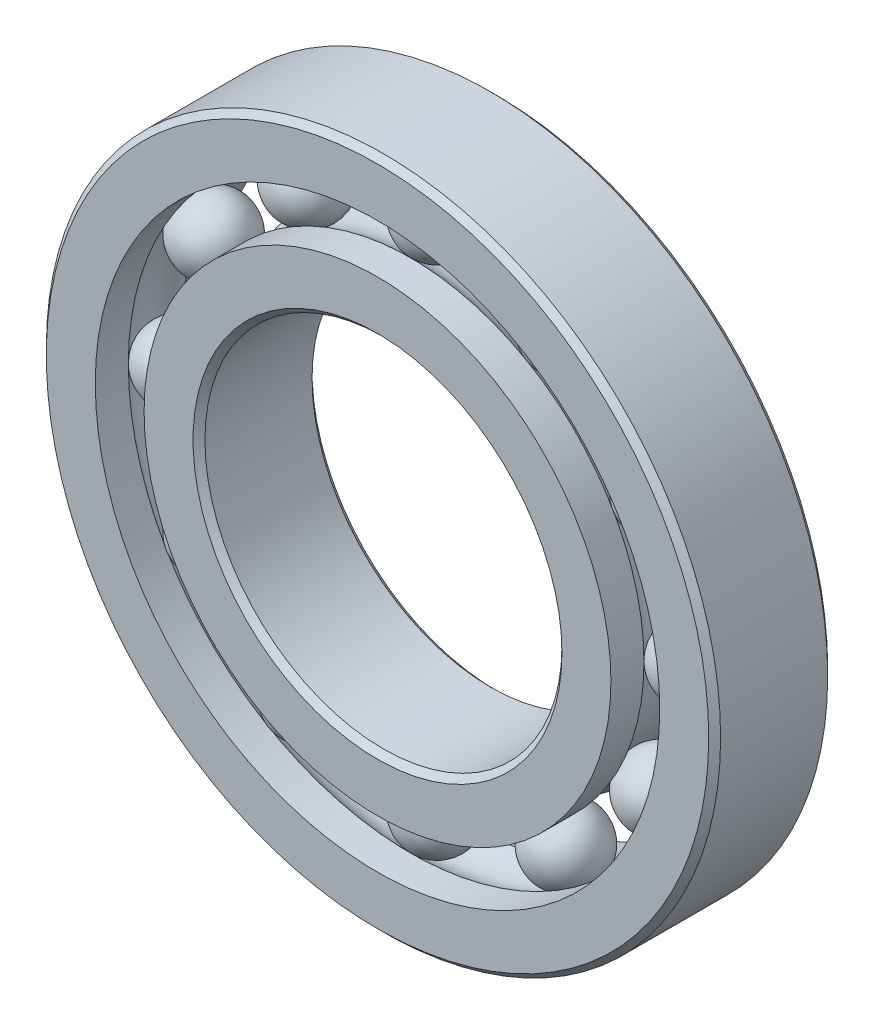
ISO-10303-21;
HEADER;
FILE_DESCRIPTION(('STEP AP214'),'2;1');
FILE_NAME('part.step','',(''),(''),'','','');
FILE_SCHEMA(('AUTOMOTIVE_DESIGN { 1 0 10303 214 1 1 1 1 }'));
ENDSEC;
DATA;
#1=APPLICATION_CONTEXT('core data for automotive mechanical design processes');
#2=APPLICATION_PROTOCOL_DEFINITION('international standard','automotive_design',2000,#1);
#3=PRODUCT_CONTEXT('',#1,'mechanical');
#4=PRODUCT('Part','Part','',(#3));
#5=PRODUCT_RELATED_PRODUCT_CATEGORY('part','',(#4));
#6=PRODUCT_DEFINITION_FORMATION('','',#4);
#7=PRODUCT_DEFINITION_CONTEXT('part definition',#1,'design');
#8=PRODUCT_DEFINITION('design','',#6,#7);
#9=PRODUCT_DEFINITION_SHAPE('','',#8);
#10=(LENGTH_UNIT() NAMED_UNIT(*) SI_UNIT(.MILLI.,.METRE.));
#11=(NAMED_UNIT(*) PLANE_ANGLE_UNIT() SI_UNIT($,.RADIAN.));
#12=(NAMED_UNIT(*) SI_UNIT($,.STERADIAN.) SOLID_ANGLE_UNIT());
#13=UNCERTAINTY_MEASURE_WITH_UNIT(LENGTH_MEASURE(1.E-05),#10,'distance_accuracy_value','');
#14=(GEOMETRIC_REPRESENTATION_CONTEXT(3) GLOBAL_UNCERTAINTY_ASSIGNED_CONTEXT((#13)) GLOBAL_UNIT_ASSIGNED_CONTEXT((#10,
#11,#12)) REPRESENTATION_CONTEXT('',''));
#15=CARTESIAN_POINT('',(0.,0.,0.));
#16=DIRECTION('',(0.,0.,1.));
#17=DIRECTION('',(1.,0.,0.));
#18=AXIS2_PLACEMENT_3D('',#15,#16,#17);
#19=CARTESIAN_POINT('',(-10.3187499999998,17.8725992706015,0.));
#20=DIRECTION('',(0.,0.,1.));
#21=DIRECTION('',(-0.499999999999989,0.866025403784445,0.));
#22=AXIS2_PLACEMENT_3D('',#19,#20,#21);
#23=SPHERICAL_SURFACE('',#22,2.88058892775022);
#24=CARTESIAN_POINT('',(-10.3187499999998,17.8725992706015,2.88058892775022));
#25=VERTEX_POINT('',#24);
#26=VERTEX_LOOP('',#25);
#27=FACE_BOUND('',#26,.T.);
#28=ADVANCED_FACE('F44',(#27),#23,.T.);
#29=CLOSED_SHELL('',(#28));
#30=MANIFOLD_SOLID_BREP('B2',#29);
#31=CARTESIAN_POINT('',(-17.8725992706012,10.3187500000002,0.));
#32=DIRECTION('',(0.,0.,1.));
#33=DIRECTION('',(-0.866025403784433,0.50000000000001,0.));
#34=AXIS2_PLACEMENT_3D('',#31,#32,#33);
#35=SPHERICAL_SURFACE('',#34,2.88058892775022);
#36=CARTESIAN_POINT('',(-17.8725992706012,10.3187500000002,2.88058892775022));
#37=VERTEX_POINT('',#36);
#38=VERTEX_LOOP('',#37);
#39=FACE_BOUND('',#38,.T.);
#40=ADVANCED_FACE('F67',(#39),#35,.T.);
#41=CLOSED_SHELL('',(#40));
#42=MANIFOLD_SOLID_BREP('B6',#41);
#43=CARTESIAN_POINT('',(-20.6375,2.16166338391125E-13,0.));
#44=DIRECTION('',(0.,0.,1.));
#45=DIRECTION('',(-1.,0.,0.));
#46=AXIS2_PLACEMENT_3D('',#43,#44,#45);
#47=SPHERICAL_SURFACE('',#46,2.88058892775022);
#48=CARTESIAN_POINT('',(-20.6375,2.16166338391125E-13,2.88058892775022));
#49=VERTEX_POINT('',#48);
#50=VERTEX_LOOP('',#49);
#51=FACE_BOUND('',#50,.T.);
#52=ADVANCED_FACE('F90',(#51),#47,.T.);
#53=CLOSED_SHELL('',(#52));
#54=MANIFOLD_SOLID_BREP('B40',#53);
#55=CARTESIAN_POINT('',(-17.8725992706014,-10.3187499999998,0.));
#56=DIRECTION('',(0.,0.,1.));
#57=DIRECTION('',(-0.866025403784443,-0.499999999999992,0.));
#58=AXIS2_PLACEMENT_3D('',#55,#56,#57);
#59=SPHERICAL_SURFACE('',#58,2.88058892775022);
#60=CARTESIAN_POINT('',(-17.8725992706014,-10.3187499999998,2.88058892775022));
#61=VERTEX_POINT('',#60);
#62=VERTEX_LOOP('',#61);
#63=FACE_BOUND('',#62,.T.);
#64=ADVANCED_FACE('F113',(#63),#59,.T.);
#65=CLOSED_SHELL('',(#64));
#66=MANIFOLD_SOLID_BREP('B63',#65);
#67=CARTESIAN_POINT('',(-10.3187500000001,-17.8725992706013,0.));
#68=DIRECTION('',(0.,0.,1.));
#69=DIRECTION('',(-0.500000000000007,-0.866025403784435,0.));
#70=AXIS2_PLACEMENT_3D('',#67,#68,#69);
#71=SPHERICAL_SURFACE('',#70,2.88058892775022);
#72=CARTESIAN_POINT('',(-10.3187500000001,-17.8725992706013,2.88058892775022));
#73=VERTEX_POINT('',#72);
#74=VERTEX_LOOP('',#73);
#75=FACE_BOUND('',#74,.T.);
#76=ADVANCED_FACE('F136',(#75),#71,.T.);
#77=CLOSED_SHELL('',(#76));
#78=MANIFOLD_SOLID_BREP('B86',#77);
#79=CARTESIAN_POINT('',(-1.4411089226075E-13,-20.6375,0.));
#80=DIRECTION('',(0.,0.,1.));
#81=DIRECTION('',(0.,-1.,0.));
#82=AXIS2_PLACEMENT_3D('',#79,#80,#81);
#83=SPHERICAL_SURFACE('',#82,2.88058892775022);
#84=CARTESIAN_POINT('',(-1.4411089226075E-13,-20.6375,2.88058892775022));
#85=VERTEX_POINT('',#84);
#86=VERTEX_LOOP('',#85);
#87=FACE_BOUND('',#86,.T.);
#88=ADVANCED_FACE('F159',(#87),#83,.T.);
#89=CLOSED_SHELL('',(#88));
#90=MANIFOLD_SOLID_BREP('B109',#89);
#91=CARTESIAN_POINT('',(10.3187499999999,-17.8725992706014,0.));
#92=DIRECTION('',(0.,0.,1.));
#93=DIRECTION('',(0.499999999999995,-0.866025403784442,0.));
#94=AXIS2_PLACEMENT_3D('',#91,#92,#93);
#95=SPHERICAL_SURFACE('',#94,2.88058892775022);
#96=CARTESIAN_POINT('',(10.3187499999999,-17.8725992706014,2.88058892775022));
#97=VERTEX_POINT('',#96);
#98=VERTEX_LOOP('',#97);
#99=FACE_BOUND('',#98,.T.);
#100=ADVANCED_FACE('F182',(#99),#95,.T.);
#101=CLOSED_SHELL('',(#100));
#102=MANIFOLD_SOLID_BREP('B132',#101);
#103=CARTESIAN_POINT('',(17.8725992706013,-10.3187500000001,0.));
#104=DIRECTION('',(0.,0.,1.));
#105=DIRECTION('',(0.866025403784436,-0.500000000000004,0.));
#106=AXIS2_PLACEMENT_3D('',#103,#104,#105);
#107=SPHERICAL_SURFACE('',#106,2.88058892775022);
#108=CARTESIAN_POINT('',(17.8725992706013,-10.3187500000001,2.88058892775022));
#109=VERTEX_POINT('',#108);
#110=VERTEX_LOOP('',#109);
#111=FACE_BOUND('',#110,.T.);
#112=ADVANCED_FACE('F205',(#111),#107,.T.);
#113=CLOSED_SHELL('',(#112));
#114=MANIFOLD_SOLID_BREP('B155',#113);
#115=CARTESIAN_POINT('',(20.6375,0.,0.));
#116=DIRECTION('',(0.,0.,1.));
#117=DIRECTION('',(1.,0.,0.));
#118=AXIS2_PLACEMENT_3D('',#115,#116,#117);
#119=SPHERICAL_SURFACE('',#118,2.88058892775022);
#120=CARTESIAN_POINT('',(20.6375,0.,2.88058892775022));
#121=VERTEX_POINT('',#120);
#122=VERTEX_LOOP('',#121);
#123=FACE_BOUND('',#122,.T.);
#124=ADVANCED_FACE('F228',(#123),#119,.T.);
#125=CLOSED_SHELL('',(#124));
#126=MANIFOLD_SOLID_BREP('B178',#125);
#127=CARTESIAN_POINT('',(17.8725992706014,10.31875,0.));
#128=DIRECTION('',(0.,0.,1.));
#129=DIRECTION('',(0.86602540378444,0.499999999999998,0.));
#130=AXIS2_PLACEMENT_3D('',#127,#128,#129);
#131=SPHERICAL_SURFACE('',#130,2.88058892775022);
#132=CARTESIAN_POINT('',(17.8725992706014,10.31875,2.88058892775022));
#133=VERTEX_POINT('',#132);
#134=VERTEX_LOOP('',#133);
#135=FACE_BOUND('',#134,.T.);
#136=ADVANCED_FACE('F251',(#135),#131,.T.);
#137=CLOSED_SHELL('',(#136));
#138=MANIFOLD_SOLID_BREP('B201',#137);
#139=CARTESIAN_POINT('',(10.31875,17.8725992706013,0.));
#140=DIRECTION('',(0.,0.,1.));
#141=DIRECTION('',(0.500000000000001,0.866025403784438,0.));
#142=AXIS2_PLACEMENT_3D('',#139,#140,#141);
#143=SPHERICAL_SURFACE('',#142,2.88058892775022);
#144=CARTESIAN_POINT('',(10.31875,17.8725992706013,2.88058892775022));
#145=VERTEX_POINT('',#144);
#146=VERTEX_LOOP('',#145);
#147=FACE_BOUND('',#146,.T.);
#148=ADVANCED_FACE('F274',(#147),#143,.T.);
#149=CLOSED_SHELL('',(#148));
#150=MANIFOLD_SOLID_BREP('B224',#149);
#151=CARTESIAN_POINT('',(0.,20.6375,0.));
#152=DIRECTION('',(0.,0.,1.));
#153=DIRECTION('',(0.,1.,0.));
#154=AXIS2_PLACEMENT_3D('',#151,#152,#153);
#155=SPHERICAL_SURFACE('',#154,2.88058892775022);
#156=CARTESIAN_POINT('',(0.,20.6375,2.88058892775022));
#157=VERTEX_POINT('',#156);
#158=VERTEX_LOOP('',#157);
#159=FACE_BOUND('',#158,.T.);
#160=ADVANCED_FACE('F299',(#159),#155,.T.);
#161=CLOSED_SHELL('',(#160));
#162=MANIFOLD_SOLID_BREP('B247',#161);
#163=CARTESIAN_POINT('',(0.,18.6836538461539,4.7625));
#164=DIRECTION('',(0.,0.,-1.));
#165=DIRECTION('',(-1.,0.,0.));
#166=AXIS2_PLACEMENT_3D('',#163,#164,#165);
#167=PLANE('',#166);
#168=CARTESIAN_POINT('',(0.,0.,4.7625));
#169=DIRECTION('',(0.,0.,1.));
#170=DIRECTION('',(1.,0.,0.));
#171=AXIS2_PLACEMENT_3D('',#168,#169,#170);
#172=CIRCLE('',#171,14.76375);
#173=CARTESIAN_POINT('',(14.76375,0.,4.7625));
#174=VERTEX_POINT('',#173);
#175=EDGE_CURVE('E349',#174,#174,#172,.T.);
#176=ORIENTED_EDGE('',*,*,#175,.F.);
#177=EDGE_LOOP('',(#176));
#178=FACE_BOUND('',#177,.T.);
#179=CARTESIAN_POINT('',(0.,0.,4.76250000000001));
#180=DIRECTION('',(0.,0.,1.));
#181=DIRECTION('',(1.,0.,0.));
#182=AXIS2_PLACEMENT_3D('',#179,#180,#181);
#183=CIRCLE('',#182,18.6836538461539);
#184=CARTESIAN_POINT('',(18.6836538461539,0.,4.76250000000001));
#185=VERTEX_POINT('',#184);
#186=EDGE_CURVE('E298',#185,#185,#183,.T.);
#187=ORIENTED_EDGE('',*,*,#186,.T.);
#188=EDGE_LOOP('',(#187));
#189=FACE_BOUND('',#188,.T.);
#190=ADVANCED_FACE('F321',(#178,#189),#167,.F.);
#191=CARTESIAN_POINT('',(0.,0.,4.7625));
#192=DIRECTION('',(0.,0.,1.));
#193=DIRECTION('',(1.,0.,0.));
#194=AXIS2_PLACEMENT_3D('',#191,#192,#193);
#195=CYLINDRICAL_SURFACE('',#194,18.6836538461539);
#196=ORIENTED_EDGE('',*,*,#186,.F.);
#197=EDGE_LOOP('',(#196));
#198=FACE_BOUND('',#197,.T.);
#199=CARTESIAN_POINT('',(0.,0.,2.11666666666667));
#200=DIRECTION('',(0.,0.,1.));
#201=DIRECTION('',(1.,0.,0.));
#202=AXIS2_PLACEMENT_3D('',#199,#200,#201);
#203=CIRCLE('',#202,18.6836538461539);
#204=CARTESIAN_POINT('',(18.6836538461539,0.,2.11666666666667));
#205=VERTEX_POINT('',#204);
#206=EDGE_CURVE('E327',#205,#205,#203,.T.);
#207=ORIENTED_EDGE('',*,*,#206,.T.);
#208=EDGE_LOOP('',(#207));
#209=FACE_BOUND('',#208,.T.);
#210=ADVANCED_FACE('F356',(#198,#209),#195,.T.);
#211=CARTESIAN_POINT('',(0.,0.,0.));
#212=DIRECTION('',(0.,0.,1.));
#213=DIRECTION('',(1.,0.,0.));
#214=AXIS2_PLACEMENT_3D('',#211,#212,#213);
#215=TOROIDAL_SURFACE('',#214,20.6375,2.88058892775022);
#216=ORIENTED_EDGE('',*,*,#206,.F.);
#217=EDGE_LOOP('',(#216));
#218=FACE_BOUND('',#217,.T.);
#219=CARTESIAN_POINT('',(0.,0.,-2.11666666666667));
#220=DIRECTION('',(0.,0.,1.));
#221=DIRECTION('',(1.,0.,0.));
#222=AXIS2_PLACEMENT_3D('',#219,#220,#221);
#223=CIRCLE('',#222,18.6836538461539);
#224=CARTESIAN_POINT('',(18.6836538461539,0.,-2.11666666666667));
#225=VERTEX_POINT('',#224);
#226=EDGE_CURVE('E331',#225,#225,#223,.T.);
#227=ORIENTED_EDGE('',*,*,#226,.T.);
#228=EDGE_LOOP('',(#227));
#229=FACE_BOUND('',#228,.T.);
#230=ADVANCED_FACE('F360',(#218,#229),#215,.F.);
#231=CARTESIAN_POINT('',(0.,0.,4.7625));
#232=DIRECTION('',(0.,0.,1.));
#233=DIRECTION('',(1.,0.,0.));
#234=AXIS2_PLACEMENT_3D('',#231,#232,#233);
#235=CYLINDRICAL_SURFACE('',#234,18.6836538461539);
#236=ORIENTED_EDGE('',*,*,#226,.F.);
#237=EDGE_LOOP('',(#236));
#238=FACE_BOUND('',#237,.T.);
#239=CARTESIAN_POINT('',(0.,0.,-4.76250000000001));
#240=DIRECTION('',(0.,0.,1.));
#241=DIRECTION('',(1.,0.,0.));
#242=AXIS2_PLACEMENT_3D('',#239,#240,#241);
#243=CIRCLE('',#242,18.6836538461539);
#244=CARTESIAN_POINT('',(18.6836538461539,0.,-4.76250000000001));
#245=VERTEX_POINT('',#244);
#246=EDGE_CURVE('E335',#245,#245,#243,.T.);
#247=ORIENTED_EDGE('',*,*,#246,.T.);
#248=EDGE_LOOP('',(#247));
#249=FACE_BOUND('',#248,.T.);
#250=ADVANCED_FACE('F365',(#238,#249),#235,.T.);
#251=CARTESIAN_POINT('',(0.,14.76375,-4.76250000000001));
#252=DIRECTION('',(0.,0.,1.));
#253=DIRECTION('',(1.,0.,0.));
#254=AXIS2_PLACEMENT_3D('',#251,#252,#253);
#255=PLANE('',#254);
#256=ORIENTED_EDGE('',*,*,#246,.F.);
#257=EDGE_LOOP('',(#256));
#258=FACE_BOUND('',#257,.T.);
#259=CARTESIAN_POINT('',(0.,0.,-4.76250000000001));
#260=DIRECTION('',(0.,0.,1.));
#261=DIRECTION('',(1.,0.,0.));
#262=AXIS2_PLACEMENT_3D('',#259,#260,#261);
#263=CIRCLE('',#262,14.76375);
#264=CARTESIAN_POINT('',(14.76375,0.,-4.76250000000001));
#265=VERTEX_POINT('',#264);
#266=EDGE_CURVE('E340',#265,#265,#263,.T.);
#267=ORIENTED_EDGE('',*,*,#266,.T.);
#268=EDGE_LOOP('',(#267));
#269=FACE_BOUND('',#268,.T.);
#270=ADVANCED_FACE('F371',(#258,#269),#255,.F.);
#271=CARTESIAN_POINT('',(0.,0.,-4.28625));
#272=DIRECTION('',(0.,0.,-1.));
#273=DIRECTION('',(-1.,0.,0.));
#274=AXIS2_PLACEMENT_3D('',#271,#272,#273);
#275=CONICAL_SURFACE('',#274,14.2875,0.785398163397445);
#276=ORIENTED_EDGE('',*,*,#266,.F.);
#277=EDGE_LOOP('',(#276));
#278=FACE_BOUND('',#277,.T.);
#279=CARTESIAN_POINT('',(0.,0.,-4.28625));
#280=DIRECTION('',(0.,0.,1.));
#281=DIRECTION('',(1.,0.,0.));
#282=AXIS2_PLACEMENT_3D('',#279,#280,#281);
#283=CIRCLE('',#282,14.2875);
#284=CARTESIAN_POINT('',(14.2875,0.,-4.28625));
#285=VERTEX_POINT('',#284);
#286=EDGE_CURVE('E343',#285,#285,#283,.T.);
#287=ORIENTED_EDGE('',*,*,#286,.T.);
#288=EDGE_LOOP('',(#287));
#289=FACE_BOUND('',#288,.T.);
#290=ADVANCED_FACE('F375',(#278,#289),#275,.F.);
#291=CARTESIAN_POINT('',(0.,0.,4.7625));
#292=DIRECTION('',(0.,0.,1.));
#293=DIRECTION('',(1.,0.,0.));
#294=AXIS2_PLACEMENT_3D('',#291,#292,#293);
#295=CYLINDRICAL_SURFACE('',#294,14.2875);
#296=ORIENTED_EDGE('',*,*,#286,.F.);
#297=EDGE_LOOP('',(#296));
#298=FACE_BOUND('',#297,.T.);
#299=CARTESIAN_POINT('',(0.,0.,4.28625000000001));
#300=DIRECTION('',(0.,0.,1.));
#301=DIRECTION('',(1.,0.,0.));
#302=AXIS2_PLACEMENT_3D('',#299,#300,#301);
#303=CIRCLE('',#302,14.2875);
#304=CARTESIAN_POINT('',(14.2875,0.,4.28625000000001));
#305=VERTEX_POINT('',#304);
#306=EDGE_CURVE('E346',#305,#305,#303,.T.);
#307=ORIENTED_EDGE('',*,*,#306,.T.);
#308=EDGE_LOOP('',(#307));
#309=FACE_BOUND('',#308,.T.);
#310=ADVANCED_FACE('F379',(#298,#309),#295,.F.);
#311=CARTESIAN_POINT('',(0.,0.,4.7625));
#312=DIRECTION('',(0.,0.,1.));
#313=DIRECTION('',(1.,0.,0.));
#314=AXIS2_PLACEMENT_3D('',#311,#312,#313);
#315=CONICAL_SURFACE('',#314,14.76375,0.785398163397458);
#316=ORIENTED_EDGE('',*,*,#306,.F.);
#317=EDGE_LOOP('',(#316));
#318=FACE_BOUND('',#317,.T.);
#319=ORIENTED_EDGE('',*,*,#175,.T.);
#320=EDGE_LOOP('',(#319));
#321=FACE_BOUND('',#320,.T.);
#322=ADVANCED_FACE('F353',(#318,#321),#315,.F.);
#323=CLOSED_SHELL('',(#190,#210,#230,#250,#270,#290,#310,#322));
#324=MANIFOLD_SOLID_BREP('B270',#323);
#325=CARTESIAN_POINT('',(0.,0.,4.28625));
#326=DIRECTION('',(0.,0.,-1.));
#327=DIRECTION('',(-1.,0.,0.));
#328=AXIS2_PLACEMENT_3D('',#325,#326,#327);
#329=CONICAL_SURFACE('',#328,26.9875,0.785398163397449);
#330=CARTESIAN_POINT('',(0.,0.,4.7625));
#331=DIRECTION('',(0.,0.,1.));
#332=DIRECTION('',(1.,0.,0.));
#333=AXIS2_PLACEMENT_3D('',#330,#331,#332);
#334=CIRCLE('',#333,26.51125);
#335=CARTESIAN_POINT('',(26.51125,0.,4.7625));
#336=VERTEX_POINT('',#335);
#337=EDGE_CURVE('E473',#336,#336,#334,.T.);
#338=ORIENTED_EDGE('',*,*,#337,.F.);
#339=EDGE_LOOP('',(#338));
#340=FACE_BOUND('',#339,.T.);
#341=CARTESIAN_POINT('',(0.,0.,4.28625));
#342=DIRECTION('',(0.,0.,1.));
#343=DIRECTION('',(1.,0.,0.));
#344=AXIS2_PLACEMENT_3D('',#341,#342,#343);
#345=CIRCLE('',#344,26.9875);
#346=CARTESIAN_POINT('',(26.9875,0.,4.28625));
#347=VERTEX_POINT('',#346);
#348=EDGE_CURVE('E320',#347,#347,#345,.T.);
#349=ORIENTED_EDGE('',*,*,#348,.T.);
#350=EDGE_LOOP('',(#349));
#351=FACE_BOUND('',#350,.T.);
#352=ADVANCED_FACE('F445',(#340,#351),#329,.T.);
#353=CARTESIAN_POINT('',(0.,0.,4.7625));
#354=DIRECTION('',(0.,0.,1.));
#355=DIRECTION('',(1.,0.,0.));
#356=AXIS2_PLACEMENT_3D('',#353,#354,#355);
#357=CYLINDRICAL_SURFACE('',#356,26.9875);
#358=ORIENTED_EDGE('',*,*,#348,.F.);
#359=EDGE_LOOP('',(#358));
#360=FACE_BOUND('',#359,.T.);
#361=CARTESIAN_POINT('',(0.,0.,-4.28625));
#362=DIRECTION('',(0.,0.,1.));
#363=DIRECTION('',(1.,0.,0.));
#364=AXIS2_PLACEMENT_3D('',#361,#362,#363);
#365=CIRCLE('',#364,26.9875);
#366=CARTESIAN_POINT('',(26.9875,0.,-4.28625));
#367=VERTEX_POINT('',#366);
#368=EDGE_CURVE('E451',#367,#367,#365,.T.);
#369=ORIENTED_EDGE('',*,*,#368,.T.);
#370=EDGE_LOOP('',(#369));
#371=FACE_BOUND('',#370,.T.);
#372=ADVANCED_FACE('F480',(#360,#371),#357,.T.);
#373=CARTESIAN_POINT('',(0.,0.,-4.76250000000001));
#374=DIRECTION('',(0.,0.,1.));
#375=DIRECTION('',(1.,0.,0.));
#376=AXIS2_PLACEMENT_3D('',#373,#374,#375);
#377=CONICAL_SURFACE('',#376,26.51125,0.785398163397448);
#378=ORIENTED_EDGE('',*,*,#368,.F.);
#379=EDGE_LOOP('',(#378));
#380=FACE_BOUND('',#379,.T.);
#381=CARTESIAN_POINT('',(0.,0.,-4.76250000000001));
#382=DIRECTION('',(0.,0.,1.));
#383=DIRECTION('',(1.,0.,0.));
#384=AXIS2_PLACEMENT_3D('',#381,#382,#383);
#385=CIRCLE('',#384,26.51125);
#386=CARTESIAN_POINT('',(26.51125,0.,-4.76250000000001));
#387=VERTEX_POINT('',#386);
#388=EDGE_CURVE('E455',#387,#387,#385,.T.);
#389=ORIENTED_EDGE('',*,*,#388,.T.);
#390=EDGE_LOOP('',(#389));
#391=FACE_BOUND('',#390,.T.);
#392=ADVANCED_FACE('F484',(#380,#391),#377,.T.);
#393=CARTESIAN_POINT('',(0.,26.51125,-4.76250000000001));
#394=DIRECTION('',(0.,0.,1.));
#395=DIRECTION('',(1.,0.,0.));
#396=AXIS2_PLACEMENT_3D('',#393,#394,#395);
#397=PLANE('',#396);
#398=ORIENTED_EDGE('',*,*,#388,.F.);
#399=EDGE_LOOP('',(#398));
#400=FACE_BOUND('',#399,.T.);
#401=CARTESIAN_POINT('',(0.,0.,-4.76250000000001));
#402=DIRECTION('',(0.,0.,1.));
#403=DIRECTION('',(1.,0.,0.));
#404=AXIS2_PLACEMENT_3D('',#401,#402,#403);
#405=CIRCLE('',#404,22.5913461538461);
#406=CARTESIAN_POINT('',(22.5913461538461,0.,-4.76250000000001));
#407=VERTEX_POINT('',#406);
#408=EDGE_CURVE('E459',#407,#407,#405,.T.);
#409=ORIENTED_EDGE('',*,*,#408,.T.);
#410=EDGE_LOOP('',(#409));
#411=FACE_BOUND('',#410,.T.);
#412=ADVANCED_FACE('F489',(#400,#411),#397,.F.);
#413=CARTESIAN_POINT('',(0.,0.,4.7625));
#414=DIRECTION('',(0.,0.,1.));
#415=DIRECTION('',(1.,0.,0.));
#416=AXIS2_PLACEMENT_3D('',#413,#414,#415);
#417=CYLINDRICAL_SURFACE('',#416,22.5913461538461);
#418=ORIENTED_EDGE('',*,*,#408,.F.);
#419=EDGE_LOOP('',(#418));
#420=FACE_BOUND('',#419,.T.);
#421=CARTESIAN_POINT('',(0.,0.,-2.11666666666667));
#422=DIRECTION('',(0.,0.,1.));
#423=DIRECTION('',(1.,0.,0.));
#424=AXIS2_PLACEMENT_3D('',#421,#422,#423);
#425=CIRCLE('',#424,22.5913461538461);
#426=CARTESIAN_POINT('',(22.5913461538461,0.,-2.11666666666667));
#427=VERTEX_POINT('',#426);
#428=EDGE_CURVE('E464',#427,#427,#425,.T.);
#429=ORIENTED_EDGE('',*,*,#428,.T.);
#430=EDGE_LOOP('',(#429));
#431=FACE_BOUND('',#430,.T.);
#432=ADVANCED_FACE('F495',(#420,#431),#417,.F.);
#433=CARTESIAN_POINT('',(0.,0.,0.));
#434=DIRECTION('',(0.,0.,1.));
#435=DIRECTION('',(1.,0.,0.));
#436=AXIS2_PLACEMENT_3D('',#433,#434,#435);
#437=TOROIDAL_SURFACE('',#436,20.6375,2.88058892775022);
#438=ORIENTED_EDGE('',*,*,#428,.F.);
#439=EDGE_LOOP('',(#438));
#440=FACE_BOUND('',#439,.T.);
#441=CARTESIAN_POINT('',(0.,0.,2.11666666666666));
#442=DIRECTION('',(0.,0.,1.));
#443=DIRECTION('',(1.,0.,0.));
#444=AXIS2_PLACEMENT_3D('',#441,#442,#443);
#445=CIRCLE('',#444,22.5913461538461);
#446=CARTESIAN_POINT('',(22.5913461538461,0.,2.11666666666666));
#447=VERTEX_POINT('',#446);
#448=EDGE_CURVE('E467',#447,#447,#445,.T.);
#449=ORIENTED_EDGE('',*,*,#448,.T.);
#450=EDGE_LOOP('',(#449));
#451=FACE_BOUND('',#450,.T.);
#452=ADVANCED_FACE('F499',(#440,#451),#437,.F.);
#453=CARTESIAN_POINT('',(0.,0.,4.7625));
#454=DIRECTION('',(0.,0.,1.));
#455=DIRECTION('',(1.,0.,0.));
#456=AXIS2_PLACEMENT_3D('',#453,#454,#455);
#457=CYLINDRICAL_SURFACE('',#456,22.5913461538461);
#458=ORIENTED_EDGE('',*,*,#448,.F.);
#459=EDGE_LOOP('',(#458));
#460=FACE_BOUND('',#459,.T.);
#461=CARTESIAN_POINT('',(0.,0.,4.7625));
#462=DIRECTION('',(0.,0.,1.));
#463=DIRECTION('',(1.,0.,0.));
#464=AXIS2_PLACEMENT_3D('',#461,#462,#463);
#465=CIRCLE('',#464,22.5913461538461);
#466=CARTESIAN_POINT('',(22.5913461538461,0.,4.7625));
#467=VERTEX_POINT('',#466);
#468=EDGE_CURVE('E470',#467,#467,#465,.T.);
#469=ORIENTED_EDGE('',*,*,#468,.T.);
#470=EDGE_LOOP('',(#469));
#471=FACE_BOUND('',#470,.T.);
#472=ADVANCED_FACE('F503',(#460,#471),#457,.F.);
#473=CARTESIAN_POINT('',(0.,26.51125,4.7625));
#474=DIRECTION('',(0.,0.,-1.));
#475=DIRECTION('',(-1.,0.,0.));
#476=AXIS2_PLACEMENT_3D('',#473,#474,#475);
#477=PLANE('',#476);
#478=ORIENTED_EDGE('',*,*,#468,.F.);
#479=EDGE_LOOP('',(#478));
#480=FACE_BOUND('',#479,.T.);
#481=ORIENTED_EDGE('',*,*,#337,.T.);
#482=EDGE_LOOP('',(#481));
#483=FACE_BOUND('',#482,.T.);
#484=ADVANCED_FACE('F477',(#480,#483),#477,.F.);
#485=CLOSED_SHELL('',(#352,#372,#392,#412,#432,#452,#472,#484));
#486=MANIFOLD_SOLID_BREP('B293',#485);
#487=ADVANCED_BREP_SHAPE_REPRESENTATION('',(#18,#30,#42,#54,#66,#78,#90,#102,#114,#126,#138,
#150,#162,#324,#486),#14);
#488=SHAPE_DEFINITION_REPRESENTATION(#9,#487);
ENDSEC;
END-ISO-10303-21;
